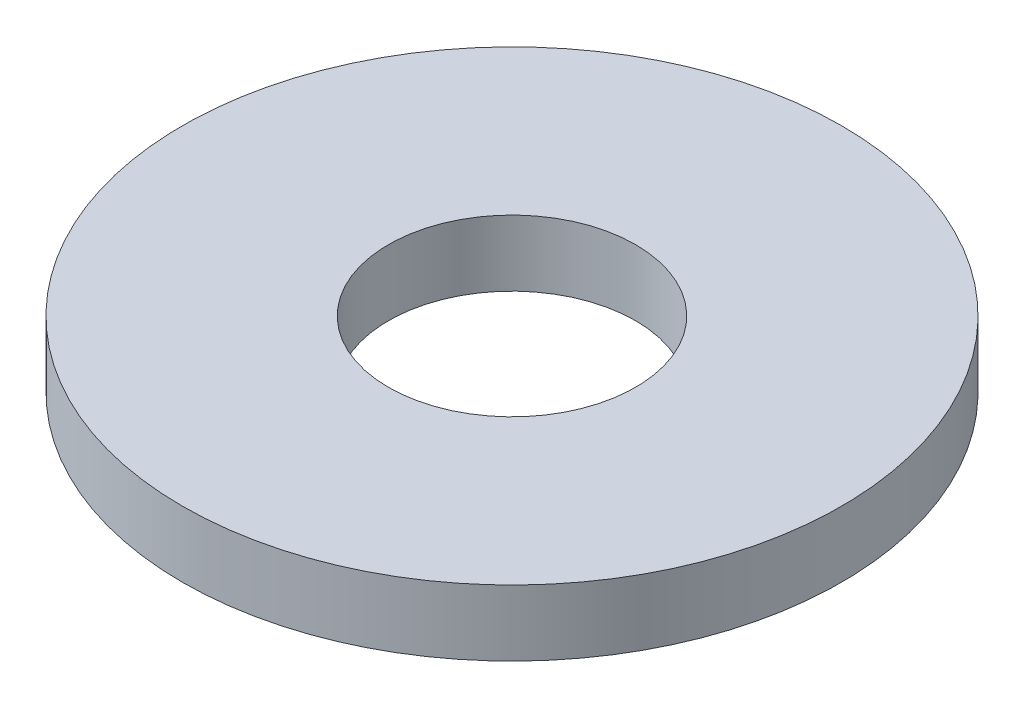
ISO-10303-21;
HEADER;
FILE_DESCRIPTION(('STEP AP214'),'2;1');
FILE_NAME('part.step','',(''),(''),'','','');
FILE_SCHEMA(('AUTOMOTIVE_DESIGN { 1 0 10303 214 1 1 1 1 }'));
ENDSEC;
DATA;
#1=APPLICATION_CONTEXT('core data for automotive mechanical design processes');
#2=APPLICATION_PROTOCOL_DEFINITION('international standard','automotive_design',2000,#1);
#3=PRODUCT_CONTEXT('',#1,'mechanical');
#4=PRODUCT('Part','Part','',(#3));
#5=PRODUCT_RELATED_PRODUCT_CATEGORY('part','',(#4));
#6=PRODUCT_DEFINITION_FORMATION('','',#4);
#7=PRODUCT_DEFINITION_CONTEXT('part definition',#1,'design');
#8=PRODUCT_DEFINITION('design','',#6,#7);
#9=PRODUCT_DEFINITION_SHAPE('','',#8);
#10=(LENGTH_UNIT() NAMED_UNIT(*) SI_UNIT(.MILLI.,.METRE.));
#11=(NAMED_UNIT(*) PLANE_ANGLE_UNIT() SI_UNIT($,.RADIAN.));
#12=(NAMED_UNIT(*) SI_UNIT($,.STERADIAN.) SOLID_ANGLE_UNIT());
#13=UNCERTAINTY_MEASURE_WITH_UNIT(LENGTH_MEASURE(1.E-05),#10,'distance_accuracy_value','');
#14=(GEOMETRIC_REPRESENTATION_CONTEXT(3) GLOBAL_UNCERTAINTY_ASSIGNED_CONTEXT((#13)) GLOBAL_UNIT_ASSIGNED_CONTEXT((#10,
#11,#12)) REPRESENTATION_CONTEXT('',''));
#15=CARTESIAN_POINT('',(0.,0.,0.));
#16=DIRECTION('',(0.,0.,1.));
#17=DIRECTION('',(1.,0.,0.));
#18=AXIS2_PLACEMENT_3D('',#15,#16,#17);
#19=CARTESIAN_POINT('',(0.,5.08,0.));
#20=DIRECTION('',(0.,-1.,0.));
#21=DIRECTION('',(0.,0.,-1.));
#22=AXIS2_PLACEMENT_3D('',#19,#20,#21);
#23=CYLINDRICAL_SURFACE('',#22,25.4);
#24=CARTESIAN_POINT('',(0.,5.08,0.));
#25=DIRECTION('',(0.,1.,0.));
#26=DIRECTION('',(0.,0.,1.));
#27=AXIS2_PLACEMENT_3D('',#24,#25,#26);
#28=CIRCLE('',#27,25.4);
#29=CARTESIAN_POINT('',(0.,5.08,25.4));
#30=VERTEX_POINT('',#29);
#31=EDGE_CURVE('E10',#30,#30,#28,.T.);
#32=ORIENTED_EDGE('',*,*,#31,.F.);
#33=EDGE_LOOP('',(#32));
#34=FACE_BOUND('',#33,.T.);
#35=CARTESIAN_POINT('',(0.,0.,0.));
#36=DIRECTION('',(0.,1.,0.));
#37=DIRECTION('',(0.,0.,1.));
#38=AXIS2_PLACEMENT_3D('',#35,#36,#37);
#39=CIRCLE('',#38,25.4);
#40=CARTESIAN_POINT('',(0.,0.,25.4));
#41=VERTEX_POINT('',#40);
#42=EDGE_CURVE('E34',#41,#41,#39,.T.);
#43=ORIENTED_EDGE('',*,*,#42,.T.);
#44=EDGE_LOOP('',(#43));
#45=FACE_BOUND('',#44,.T.);
#46=ADVANCED_FACE('F31',(#34,#45),#23,.T.);
#47=CARTESIAN_POINT('',(0.,5.08,0.));
#48=DIRECTION('',(0.,1.,0.));
#49=DIRECTION('',(0.,0.,1.));
#50=AXIS2_PLACEMENT_3D('',#47,#48,#49);
#51=PLANE('',#50);
#52=CARTESIAN_POINT('',(0.,5.08,0.));
#53=DIRECTION('',(0.,1.,0.));
#54=DIRECTION('',(0.,0.,1.));
#55=AXIS2_PLACEMENT_3D('',#52,#53,#54);
#56=CIRCLE('',#55,9.525);
#57=CARTESIAN_POINT('',(0.,5.08,9.525));
#58=VERTEX_POINT('',#57);
#59=EDGE_CURVE('E43',#58,#58,#56,.T.);
#60=ORIENTED_EDGE('',*,*,#59,.F.);
#61=EDGE_LOOP('',(#60));
#62=FACE_BOUND('',#61,.T.);
#63=ORIENTED_EDGE('',*,*,#31,.T.);
#64=EDGE_LOOP('',(#63));
#65=FACE_BOUND('',#64,.T.);
#66=ADVANCED_FACE('F58',(#62,#65),#51,.T.);
#67=CARTESIAN_POINT('',(0.,0.,0.));
#68=DIRECTION('',(0.,1.,0.));
#69=DIRECTION('',(0.,0.,1.));
#70=AXIS2_PLACEMENT_3D('',#67,#68,#69);
#71=PLANE('',#70);
#72=CARTESIAN_POINT('',(0.,0.,0.));
#73=DIRECTION('',(0.,1.,0.));
#74=DIRECTION('',(0.,0.,1.));
#75=AXIS2_PLACEMENT_3D('',#72,#73,#74);
#76=CIRCLE('',#75,9.525);
#77=CARTESIAN_POINT('',(0.,0.,9.525));
#78=VERTEX_POINT('',#77);
#79=EDGE_CURVE('E41',#78,#78,#76,.T.);
#80=ORIENTED_EDGE('',*,*,#79,.T.);
#81=EDGE_LOOP('',(#80));
#82=FACE_BOUND('',#81,.T.);
#83=ORIENTED_EDGE('',*,*,#42,.F.);
#84=EDGE_LOOP('',(#83));
#85=FACE_BOUND('',#84,.T.);
#86=ADVANCED_FACE('F49',(#82,#85),#71,.F.);
#87=CARTESIAN_POINT('',(0.,0.,0.));
#88=DIRECTION('',(0.,1.,0.));
#89=DIRECTION('',(0.,0.,1.));
#90=AXIS2_PLACEMENT_3D('',#87,#88,#89);
#91=CYLINDRICAL_SURFACE('',#90,9.525);
#92=ORIENTED_EDGE('',*,*,#79,.F.);
#93=EDGE_LOOP('',(#92));
#94=FACE_BOUND('',#93,.T.);
#95=ORIENTED_EDGE('',*,*,#59,.T.);
#96=EDGE_LOOP('',(#95));
#97=FACE_BOUND('',#96,.T.);
#98=ADVANCED_FACE('F52',(#94,#97),#91,.F.);
#99=CLOSED_SHELL('',(#46,#66,#86,#98));
#100=MANIFOLD_SOLID_BREP('B2',#99);
#101=ADVANCED_BREP_SHAPE_REPRESENTATION('',(#18,#100),#14);
#102=SHAPE_DEFINITION_REPRESENTATION(#9,#101);
ENDSEC;
END-ISO-10303-21;
